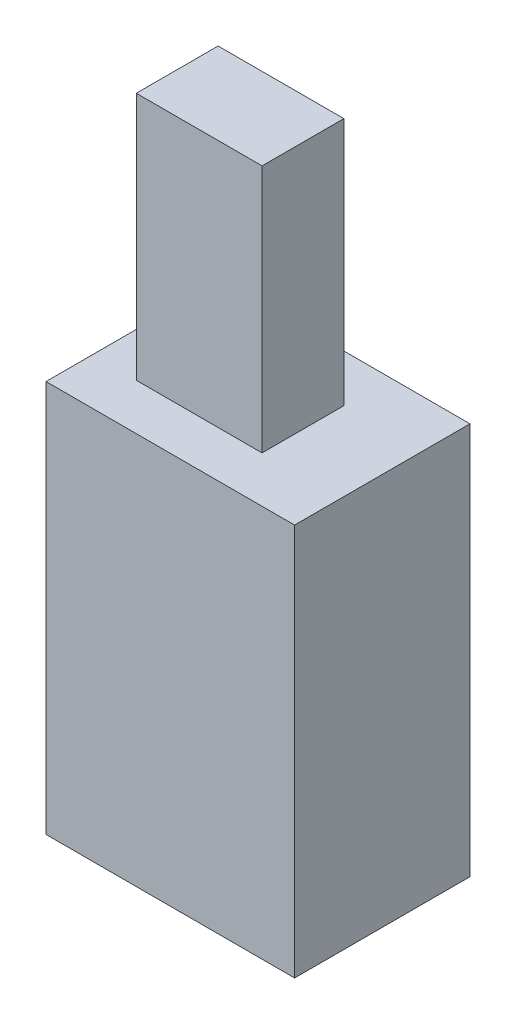
ISO-10303-21;
HEADER;
FILE_DESCRIPTION(('STEP AP214'),'2;1');
FILE_NAME('part.step','',(''),(''),'','','');
FILE_SCHEMA(('AUTOMOTIVE_DESIGN { 1 0 10303 214 1 1 1 1 }'));
ENDSEC;
DATA;
#1=APPLICATION_CONTEXT('core data for automotive mechanical design processes');
#2=APPLICATION_PROTOCOL_DEFINITION('international standard','automotive_design',2000,#1);
#3=PRODUCT_CONTEXT('',#1,'mechanical');
#4=PRODUCT('Part','Part','',(#3));
#5=PRODUCT_RELATED_PRODUCT_CATEGORY('part','',(#4));
#6=PRODUCT_DEFINITION_FORMATION('','',#4);
#7=PRODUCT_DEFINITION_CONTEXT('part definition',#1,'design');
#8=PRODUCT_DEFINITION('design','',#6,#7);
#9=PRODUCT_DEFINITION_SHAPE('','',#8);
#10=(LENGTH_UNIT() NAMED_UNIT(*) SI_UNIT(.MILLI.,.METRE.));
#11=(NAMED_UNIT(*) PLANE_ANGLE_UNIT() SI_UNIT($,.RADIAN.));
#12=(NAMED_UNIT(*) SI_UNIT($,.STERADIAN.) SOLID_ANGLE_UNIT());
#13=UNCERTAINTY_MEASURE_WITH_UNIT(LENGTH_MEASURE(1.E-05),#10,'distance_accuracy_value','');
#14=(GEOMETRIC_REPRESENTATION_CONTEXT(3) GLOBAL_UNCERTAINTY_ASSIGNED_CONTEXT((#13)) GLOBAL_UNIT_ASSIGNED_CONTEXT((#10,
#11,#12)) REPRESENTATION_CONTEXT('',''));
#15=CARTESIAN_POINT('',(0.,0.,0.));
#16=DIRECTION('',(0.,0.,1.));
#17=DIRECTION('',(1.,0.,0.));
#18=AXIS2_PLACEMENT_3D('',#15,#16,#17);
#19=CARTESIAN_POINT('',(40.,-49.1827456019109,23.0545343587494));
#20=DIRECTION('',(0.,1.,0.));
#21=DIRECTION('',(0.,0.,1.));
#22=AXIS2_PLACEMENT_3D('',#19,#20,#21);
#23=PLANE('',#22);
#24=DIRECTION('',(0.,0.,-1.));
#25=VECTOR('',#24,1.);
#26=CARTESIAN_POINT('',(0.,-49.1827456019109,23.0545343587494));
#27=LINE('',#26,#25);
#28=CARTESIAN_POINT('',(0.,-49.1827456019109,23.0545343587494));
#29=VERTEX_POINT('',#28);
#30=CARTESIAN_POINT('',(0.,-49.1827456019109,-5.1686601630081));
#31=VERTEX_POINT('',#30);
#32=EDGE_CURVE('E196',#29,#31,#27,.T.);
#33=ORIENTED_EDGE('',*,*,#32,.T.);
#34=DIRECTION('',(-1.,0.,0.));
#35=VECTOR('',#34,1.);
#36=CARTESIAN_POINT('',(40.,-49.1827456019109,-5.1686601630081));
#37=LINE('',#36,#35);
#38=CARTESIAN_POINT('',(40.,-49.1827456019109,-5.1686601630081));
#39=VERTEX_POINT('',#38);
#40=EDGE_CURVE('E42',#39,#31,#37,.T.);
#41=ORIENTED_EDGE('',*,*,#40,.F.);
#42=DIRECTION('',(0.,0.,-1.));
#43=VECTOR('',#42,1.);
#44=CARTESIAN_POINT('',(40.,-49.1827456019109,23.0545343587494));
#45=LINE('',#44,#43);
#46=CARTESIAN_POINT('',(40.,-49.1827456019109,23.0545343587494));
#47=VERTEX_POINT('',#46);
#48=EDGE_CURVE('E186',#47,#39,#45,.T.);
#49=ORIENTED_EDGE('',*,*,#48,.F.);
#50=DIRECTION('',(-1.,0.,0.));
#51=VECTOR('',#50,1.);
#52=CARTESIAN_POINT('',(40.,-49.1827456019109,23.0545343587494));
#53=LINE('',#52,#51);
#54=EDGE_CURVE('E11',#47,#29,#53,.T.);
#55=ORIENTED_EDGE('',*,*,#54,.T.);
#56=EDGE_LOOP('',(#33,#41,#49,#55));
#57=FACE_BOUND('',#56,.T.);
#58=DIRECTION('',(0.,0.,1.));
#59=VECTOR('',#58,1.);
#60=CARTESIAN_POINT('',(3.26512406669366,-49.1827456019109,13.9213634090538));
#61=LINE('',#60,#59);
#62=CARTESIAN_POINT('',(3.26512406669366,-49.1827456019109,-3.50766129720625));
#63=VERTEX_POINT('',#62);
#64=CARTESIAN_POINT('',(3.26512406669366,-49.1827456019109,13.9213634090538));
#65=VERTEX_POINT('',#64);
#66=EDGE_CURVE('E143',#63,#65,#61,.T.);
#67=ORIENTED_EDGE('',*,*,#66,.F.);
#68=DIRECTION('',(1.,0.,0.));
#69=VECTOR('',#68,1.);
#70=CARTESIAN_POINT('',(3.26512406669366,-49.1827456019109,-3.50766129720625));
#71=LINE('',#70,#69);
#72=CARTESIAN_POINT('',(1.49383084169585,-49.1827456019109,-3.50766129720625));
#73=VERTEX_POINT('',#72);
#74=EDGE_CURVE('E140',#73,#63,#71,.T.);
#75=ORIENTED_EDGE('',*,*,#74,.F.);
#76=DIRECTION('',(0.,0.,-1.));
#77=VECTOR('',#76,1.);
#78=CARTESIAN_POINT('',(1.49383084169585,-49.1827456019109,13.9213634090538));
#79=LINE('',#78,#77);
#80=CARTESIAN_POINT('',(1.49383084169585,-49.1827456019109,13.9213634090538));
#81=VERTEX_POINT('',#80);
#82=EDGE_CURVE('E54',#81,#73,#79,.T.);
#83=ORIENTED_EDGE('',*,*,#82,.F.);
#84=DIRECTION('',(-1.,0.,0.));
#85=VECTOR('',#84,1.);
#86=CARTESIAN_POINT('',(3.26512406669366,-49.1827456019109,13.9213634090538));
#87=LINE('',#86,#85);
#88=EDGE_CURVE('E49',#65,#81,#87,.T.);
#89=ORIENTED_EDGE('',*,*,#88,.F.);
#90=EDGE_LOOP('',(#67,#75,#83,#89));
#91=FACE_BOUND('',#90,.T.);
#92=ADVANCED_FACE('F34',(#57,#91),#23,.F.);
#93=CARTESIAN_POINT('',(40.,13.9355568443875,23.0545343587494));
#94=DIRECTION('',(0.,-1.,0.));
#95=DIRECTION('',(0.,0.,-1.));
#96=AXIS2_PLACEMENT_3D('',#93,#94,#95);
#97=PLANE('',#96);
#98=DIRECTION('',(0.,0.,1.));
#99=VECTOR('',#98,1.);
#100=CARTESIAN_POINT('',(0.,13.9355568443875,23.0545343587494));
#101=LINE('',#100,#99);
#102=CARTESIAN_POINT('',(0.,13.9355568443875,-5.1686601630081));
#103=VERTEX_POINT('',#102);
#104=CARTESIAN_POINT('',(0.,13.9355568443875,23.0545343587494));
#105=VERTEX_POINT('',#104);
#106=EDGE_CURVE('E187',#103,#105,#101,.T.);
#107=ORIENTED_EDGE('',*,*,#106,.T.);
#108=DIRECTION('',(-1.,0.,0.));
#109=VECTOR('',#108,1.);
#110=CARTESIAN_POINT('',(40.,13.9355568443875,23.0545343587494));
#111=LINE('',#110,#109);
#112=CARTESIAN_POINT('',(40.,13.9355568443875,23.0545343587494));
#113=VERTEX_POINT('',#112);
#114=EDGE_CURVE('E193',#113,#105,#111,.T.);
#115=ORIENTED_EDGE('',*,*,#114,.F.);
#116=DIRECTION('',(0.,0.,1.));
#117=VECTOR('',#116,1.);
#118=CARTESIAN_POINT('',(40.,13.9355568443875,23.0545343587494));
#119=LINE('',#118,#117);
#120=CARTESIAN_POINT('',(40.,13.9355568443875,-5.1686601630081));
#121=VERTEX_POINT('',#120);
#122=EDGE_CURVE('E191',#121,#113,#119,.T.);
#123=ORIENTED_EDGE('',*,*,#122,.F.);
#124=DIRECTION('',(-1.,0.,0.));
#125=VECTOR('',#124,1.);
#126=CARTESIAN_POINT('',(40.,13.9355568443875,-5.1686601630081));
#127=LINE('',#126,#125);
#128=EDGE_CURVE('E203',#121,#103,#127,.T.);
#129=ORIENTED_EDGE('',*,*,#128,.T.);
#130=EDGE_LOOP('',(#107,#115,#123,#129));
#131=FACE_BOUND('',#130,.T.);
#132=DIRECTION('',(0.,0.,1.));
#133=VECTOR('',#132,1.);
#134=CARTESIAN_POINT('',(7.08671618059498,13.9355568443875,2.45036978078872));
#135=LINE('',#134,#133);
#136=CARTESIAN_POINT('',(7.08671618059498,13.9355568443875,2.45036978078872));
#137=VERTEX_POINT('',#136);
#138=CARTESIAN_POINT('',(7.08671618059498,13.9355568443875,15.6158562248265));
#139=VERTEX_POINT('',#138);
#140=EDGE_CURVE('E144',#137,#139,#135,.T.);
#141=ORIENTED_EDGE('',*,*,#140,.F.);
#142=DIRECTION('',(-1.,0.,0.));
#143=VECTOR('',#142,1.);
#144=CARTESIAN_POINT('',(7.08671618059498,13.9355568443875,2.45036978078872));
#145=LINE('',#144,#143);
#146=CARTESIAN_POINT('',(27.3271157420822,13.9355568443875,2.45036978078872));
#147=VERTEX_POINT('',#146);
#148=EDGE_CURVE('E157',#147,#137,#145,.T.);
#149=ORIENTED_EDGE('',*,*,#148,.F.);
#150=DIRECTION('',(0.,0.,-1.));
#151=VECTOR('',#150,1.);
#152=CARTESIAN_POINT('',(27.3271157420822,13.9355568443875,2.45036978078872));
#153=LINE('',#152,#151);
#154=CARTESIAN_POINT('',(27.3271157420822,13.9355568443875,15.6158562248265));
#155=VERTEX_POINT('',#154);
#156=EDGE_CURVE('E166',#155,#147,#153,.T.);
#157=ORIENTED_EDGE('',*,*,#156,.F.);
#158=DIRECTION('',(1.,0.,0.));
#159=VECTOR('',#158,1.);
#160=CARTESIAN_POINT('',(7.08671618059498,13.9355568443875,15.6158562248265));
#161=LINE('',#160,#159);
#162=EDGE_CURVE('E147',#139,#155,#161,.T.);
#163=ORIENTED_EDGE('',*,*,#162,.F.);
#164=EDGE_LOOP('',(#141,#149,#157,#163));
#165=FACE_BOUND('',#164,.T.);
#166=ADVANCED_FACE('F219',(#131,#165),#97,.F.);
#167=CARTESIAN_POINT('',(40.,13.9355568443875,23.0545343587494));
#168=DIRECTION('',(0.,0.,-1.));
#169=DIRECTION('',(-1.,0.,0.));
#170=AXIS2_PLACEMENT_3D('',#167,#168,#169);
#171=PLANE('',#170);
#172=DIRECTION('',(0.,-1.,0.));
#173=VECTOR('',#172,1.);
#174=CARTESIAN_POINT('',(0.,13.9355568443875,23.0545343587494));
#175=LINE('',#174,#173);
#176=EDGE_CURVE('E182',#105,#29,#175,.T.);
#177=ORIENTED_EDGE('',*,*,#176,.T.);
#178=ORIENTED_EDGE('',*,*,#54,.F.);
#179=DIRECTION('',(0.,-1.,0.));
#180=VECTOR('',#179,1.);
#181=CARTESIAN_POINT('',(40.,13.9355568443875,23.0545343587494));
#182=LINE('',#181,#180);
#183=EDGE_CURVE('E183',#113,#47,#182,.T.);
#184=ORIENTED_EDGE('',*,*,#183,.F.);
#185=ORIENTED_EDGE('',*,*,#114,.T.);
#186=EDGE_LOOP('',(#177,#178,#184,#185));
#187=FACE_BOUND('',#186,.T.);
#188=ADVANCED_FACE('F36',(#187),#171,.F.);
#189=CARTESIAN_POINT('',(40.,13.9355568443875,-5.1686601630081));
#190=DIRECTION('',(0.,0.,1.));
#191=DIRECTION('',(1.,0.,0.));
#192=AXIS2_PLACEMENT_3D('',#189,#190,#191);
#193=PLANE('',#192);
#194=DIRECTION('',(0.,1.,0.));
#195=VECTOR('',#194,1.);
#196=CARTESIAN_POINT('',(0.,13.9355568443875,-5.1686601630081));
#197=LINE('',#196,#195);
#198=EDGE_CURVE('E198',#31,#103,#197,.T.);
#199=ORIENTED_EDGE('',*,*,#198,.T.);
#200=ORIENTED_EDGE('',*,*,#128,.F.);
#201=DIRECTION('',(0.,1.,0.));
#202=VECTOR('',#201,1.);
#203=CARTESIAN_POINT('',(40.,13.9355568443875,-5.1686601630081));
#204=LINE('',#203,#202);
#205=EDGE_CURVE('E189',#39,#121,#204,.T.);
#206=ORIENTED_EDGE('',*,*,#205,.F.);
#207=ORIENTED_EDGE('',*,*,#40,.T.);
#208=EDGE_LOOP('',(#199,#200,#206,#207));
#209=FACE_BOUND('',#208,.T.);
#210=ADVANCED_FACE('F210',(#209),#193,.F.);
#211=CARTESIAN_POINT('',(40.,0.,0.));
#212=DIRECTION('',(1.,0.,0.));
#213=DIRECTION('',(0.,0.,-1.));
#214=AXIS2_PLACEMENT_3D('',#211,#212,#213);
#215=PLANE('',#214);
#216=ORIENTED_EDGE('',*,*,#183,.T.);
#217=ORIENTED_EDGE('',*,*,#48,.T.);
#218=ORIENTED_EDGE('',*,*,#205,.T.);
#219=ORIENTED_EDGE('',*,*,#122,.T.);
#220=EDGE_LOOP('',(#216,#217,#218,#219));
#221=FACE_BOUND('',#220,.T.);
#222=ADVANCED_FACE('F226',(#221),#215,.T.);
#223=CARTESIAN_POINT('',(0.,0.,0.));
#224=DIRECTION('',(1.,0.,0.));
#225=DIRECTION('',(0.,0.,-1.));
#226=AXIS2_PLACEMENT_3D('',#223,#224,#225);
#227=PLANE('',#226);
#228=ORIENTED_EDGE('',*,*,#176,.F.);
#229=ORIENTED_EDGE('',*,*,#106,.F.);
#230=ORIENTED_EDGE('',*,*,#198,.F.);
#231=ORIENTED_EDGE('',*,*,#32,.F.);
#232=EDGE_LOOP('',(#228,#229,#230,#231));
#233=FACE_BOUND('',#232,.T.);
#234=ADVANCED_FACE('F216',(#233),#227,.F.);
#235=CARTESIAN_POINT('',(7.08671618059498,53.9355568443875,2.45036978078872));
#236=DIRECTION('',(1.,0.,0.));
#237=DIRECTION('',(0.,0.,-1.));
#238=AXIS2_PLACEMENT_3D('',#235,#236,#237);
#239=PLANE('',#238);
#240=ORIENTED_EDGE('',*,*,#140,.T.);
#241=DIRECTION('',(0.,-1.,0.));
#242=VECTOR('',#241,1.);
#243=CARTESIAN_POINT('',(7.08671618059498,53.9355568443875,15.6158562248265));
#244=LINE('',#243,#242);
#245=CARTESIAN_POINT('',(7.08671618059498,53.9355568443875,15.6158562248265));
#246=VERTEX_POINT('',#245);
#247=EDGE_CURVE('E179',#246,#139,#244,.T.);
#248=ORIENTED_EDGE('',*,*,#247,.F.);
#249=DIRECTION('',(0.,0.,1.));
#250=VECTOR('',#249,1.);
#251=CARTESIAN_POINT('',(7.08671618059498,53.9355568443875,2.45036978078872));
#252=LINE('',#251,#250);
#253=CARTESIAN_POINT('',(7.08671618059498,53.9355568443875,2.45036978078872));
#254=VERTEX_POINT('',#253);
#255=EDGE_CURVE('E153',#254,#246,#252,.T.);
#256=ORIENTED_EDGE('',*,*,#255,.F.);
#257=DIRECTION('',(0.,-1.,0.));
#258=VECTOR('',#257,1.);
#259=CARTESIAN_POINT('',(7.08671618059498,53.9355568443875,2.45036978078872));
#260=LINE('',#259,#258);
#261=EDGE_CURVE('E162',#254,#137,#260,.T.);
#262=ORIENTED_EDGE('',*,*,#261,.T.);
#263=EDGE_LOOP('',(#240,#248,#256,#262));
#264=FACE_BOUND('',#263,.T.);
#265=ADVANCED_FACE('F270',(#264),#239,.F.);
#266=CARTESIAN_POINT('',(7.08671618059498,53.9355568443875,15.6158562248265));
#267=DIRECTION('',(0.,0.,-1.));
#268=DIRECTION('',(-1.,0.,0.));
#269=AXIS2_PLACEMENT_3D('',#266,#267,#268);
#270=PLANE('',#269);
#271=ORIENTED_EDGE('',*,*,#162,.T.);
#272=DIRECTION('',(0.,-1.,0.));
#273=VECTOR('',#272,1.);
#274=CARTESIAN_POINT('',(27.3271157420822,53.9355568443875,15.6158562248265));
#275=LINE('',#274,#273);
#276=CARTESIAN_POINT('',(27.3271157420822,53.9355568443875,15.6158562248265));
#277=VERTEX_POINT('',#276);
#278=EDGE_CURVE('E176',#277,#155,#275,.T.);
#279=ORIENTED_EDGE('',*,*,#278,.F.);
#280=DIRECTION('',(1.,0.,0.));
#281=VECTOR('',#280,1.);
#282=CARTESIAN_POINT('',(7.08671618059498,53.9355568443875,15.6158562248265));
#283=LINE('',#282,#281);
#284=EDGE_CURVE('E156',#246,#277,#283,.T.);
#285=ORIENTED_EDGE('',*,*,#284,.F.);
#286=ORIENTED_EDGE('',*,*,#247,.T.);
#287=EDGE_LOOP('',(#271,#279,#285,#286));
#288=FACE_BOUND('',#287,.T.);
#289=ADVANCED_FACE('F266',(#288),#270,.F.);
#290=CARTESIAN_POINT('',(27.3271157420822,53.9355568443875,2.45036978078872));
#291=DIRECTION('',(-1.,0.,0.));
#292=DIRECTION('',(0.,0.,1.));
#293=AXIS2_PLACEMENT_3D('',#290,#291,#292);
#294=PLANE('',#293);
#295=ORIENTED_EDGE('',*,*,#156,.T.);
#296=DIRECTION('',(0.,-1.,0.));
#297=VECTOR('',#296,1.);
#298=CARTESIAN_POINT('',(27.3271157420822,53.9355568443875,2.45036978078872));
#299=LINE('',#298,#297);
#300=CARTESIAN_POINT('',(27.3271157420822,53.9355568443875,2.45036978078872));
#301=VERTEX_POINT('',#300);
#302=EDGE_CURVE('E173',#301,#147,#299,.T.);
#303=ORIENTED_EDGE('',*,*,#302,.F.);
#304=DIRECTION('',(0.,0.,-1.));
#305=VECTOR('',#304,1.);
#306=CARTESIAN_POINT('',(27.3271157420822,53.9355568443875,2.45036978078872));
#307=LINE('',#306,#305);
#308=EDGE_CURVE('E159',#277,#301,#307,.T.);
#309=ORIENTED_EDGE('',*,*,#308,.F.);
#310=ORIENTED_EDGE('',*,*,#278,.T.);
#311=EDGE_LOOP('',(#295,#303,#309,#310));
#312=FACE_BOUND('',#311,.T.);
#313=ADVANCED_FACE('F262',(#312),#294,.F.);
#314=CARTESIAN_POINT('',(7.08671618059498,53.9355568443875,2.45036978078872));
#315=DIRECTION('',(0.,0.,1.));
#316=DIRECTION('',(1.,0.,0.));
#317=AXIS2_PLACEMENT_3D('',#314,#315,#316);
#318=PLANE('',#317);
#319=ORIENTED_EDGE('',*,*,#148,.T.);
#320=ORIENTED_EDGE('',*,*,#261,.F.);
#321=DIRECTION('',(-1.,0.,0.));
#322=VECTOR('',#321,1.);
#323=CARTESIAN_POINT('',(7.08671618059498,53.9355568443875,2.45036978078872));
#324=LINE('',#323,#322);
#325=EDGE_CURVE('E161',#301,#254,#324,.T.);
#326=ORIENTED_EDGE('',*,*,#325,.F.);
#327=ORIENTED_EDGE('',*,*,#302,.T.);
#328=EDGE_LOOP('',(#319,#320,#326,#327));
#329=FACE_BOUND('',#328,.T.);
#330=ADVANCED_FACE('F258',(#329),#318,.F.);
#331=CARTESIAN_POINT('',(0.,53.9355568443875,0.));
#332=DIRECTION('',(0.,1.,0.));
#333=DIRECTION('',(0.,0.,1.));
#334=AXIS2_PLACEMENT_3D('',#331,#332,#333);
#335=PLANE('',#334);
#336=ORIENTED_EDGE('',*,*,#255,.T.);
#337=ORIENTED_EDGE('',*,*,#284,.T.);
#338=ORIENTED_EDGE('',*,*,#308,.T.);
#339=ORIENTED_EDGE('',*,*,#325,.T.);
#340=EDGE_LOOP('',(#336,#337,#338,#339));
#341=FACE_BOUND('',#340,.T.);
#342=ADVANCED_FACE('F255',(#341),#335,.T.);
#343=CARTESIAN_POINT('',(3.26512406669366,-54.1827456019109,13.9213634090538));
#344=DIRECTION('',(-1.,0.,0.));
#345=DIRECTION('',(0.,0.,1.));
#346=AXIS2_PLACEMENT_3D('',#343,#344,#345);
#347=PLANE('',#346);
#348=ORIENTED_EDGE('',*,*,#66,.T.);
#349=DIRECTION('',(0.,1.,0.));
#350=VECTOR('',#349,1.);
#351=CARTESIAN_POINT('',(3.26512406669366,-54.1827456019109,13.9213634090538));
#352=LINE('',#351,#350);
#353=CARTESIAN_POINT('',(3.26512406669366,-54.1827456019109,13.9213634090538));
#354=VERTEX_POINT('',#353);
#355=EDGE_CURVE('E124',#354,#65,#352,.T.);
#356=ORIENTED_EDGE('',*,*,#355,.F.);
#357=DIRECTION('',(0.,0.,1.));
#358=VECTOR('',#357,1.);
#359=CARTESIAN_POINT('',(3.26512406669366,-54.1827456019109,13.9213634090538));
#360=LINE('',#359,#358);
#361=CARTESIAN_POINT('',(3.26512406669366,-54.1827456019109,-3.50766129720625));
#362=VERTEX_POINT('',#361);
#363=EDGE_CURVE('E131',#362,#354,#360,.T.);
#364=ORIENTED_EDGE('',*,*,#363,.F.);
#365=DIRECTION('',(0.,1.,0.));
#366=VECTOR('',#365,1.);
#367=CARTESIAN_POINT('',(3.26512406669366,-54.1827456019109,-3.50766129720625));
#368=LINE('',#367,#366);
#369=EDGE_CURVE('E233',#362,#63,#368,.T.);
#370=ORIENTED_EDGE('',*,*,#369,.T.);
#371=EDGE_LOOP('',(#348,#356,#364,#370));
#372=FACE_BOUND('',#371,.T.);
#373=ADVANCED_FACE('F142',(#372),#347,.F.);
#374=CARTESIAN_POINT('',(3.26512406669366,-54.1827456019109,13.9213634090538));
#375=DIRECTION('',(0.,0.,-1.));
#376=DIRECTION('',(-1.,0.,0.));
#377=AXIS2_PLACEMENT_3D('',#374,#375,#376);
#378=PLANE('',#377);
#379=ORIENTED_EDGE('',*,*,#88,.T.);
#380=DIRECTION('',(0.,1.,0.));
#381=VECTOR('',#380,1.);
#382=CARTESIAN_POINT('',(1.49383084169585,-54.1827456019109,13.9213634090538));
#383=LINE('',#382,#381);
#384=CARTESIAN_POINT('',(1.49383084169585,-54.1827456019109,13.9213634090538));
#385=VERTEX_POINT('',#384);
#386=EDGE_CURVE('E127',#385,#81,#383,.T.);
#387=ORIENTED_EDGE('',*,*,#386,.F.);
#388=DIRECTION('',(-1.,0.,0.));
#389=VECTOR('',#388,1.);
#390=CARTESIAN_POINT('',(3.26512406669366,-54.1827456019109,13.9213634090538));
#391=LINE('',#390,#389);
#392=EDGE_CURVE('E120',#354,#385,#391,.T.);
#393=ORIENTED_EDGE('',*,*,#392,.F.);
#394=ORIENTED_EDGE('',*,*,#355,.T.);
#395=EDGE_LOOP('',(#379,#387,#393,#394));
#396=FACE_BOUND('',#395,.T.);
#397=ADVANCED_FACE('F122',(#396),#378,.F.);
#398=CARTESIAN_POINT('',(1.49383084169585,-54.1827456019109,13.9213634090538));
#399=DIRECTION('',(1.,0.,0.));
#400=DIRECTION('',(0.,0.,-1.));
#401=AXIS2_PLACEMENT_3D('',#398,#399,#400);
#402=PLANE('',#401);
#403=ORIENTED_EDGE('',*,*,#82,.T.);
#404=DIRECTION('',(0.,1.,0.));
#405=VECTOR('',#404,1.);
#406=CARTESIAN_POINT('',(1.49383084169585,-54.1827456019109,-3.50766129720625));
#407=LINE('',#406,#405);
#408=CARTESIAN_POINT('',(1.49383084169585,-54.1827456019109,-3.50766129720625));
#409=VERTEX_POINT('',#408);
#410=EDGE_CURVE('E149',#409,#73,#407,.T.);
#411=ORIENTED_EDGE('',*,*,#410,.F.);
#412=DIRECTION('',(0.,0.,-1.));
#413=VECTOR('',#412,1.);
#414=CARTESIAN_POINT('',(1.49383084169585,-54.1827456019109,13.9213634090538));
#415=LINE('',#414,#413);
#416=EDGE_CURVE('E130',#385,#409,#415,.T.);
#417=ORIENTED_EDGE('',*,*,#416,.F.);
#418=ORIENTED_EDGE('',*,*,#386,.T.);
#419=EDGE_LOOP('',(#403,#411,#417,#418));
#420=FACE_BOUND('',#419,.T.);
#421=ADVANCED_FACE('F242',(#420),#402,.F.);
#422=CARTESIAN_POINT('',(3.26512406669366,-54.1827456019109,-3.50766129720625));
#423=DIRECTION('',(0.,0.,1.));
#424=DIRECTION('',(1.,0.,0.));
#425=AXIS2_PLACEMENT_3D('',#422,#423,#424);
#426=PLANE('',#425);
#427=ORIENTED_EDGE('',*,*,#74,.T.);
#428=ORIENTED_EDGE('',*,*,#369,.F.);
#429=DIRECTION('',(1.,0.,0.));
#430=VECTOR('',#429,1.);
#431=CARTESIAN_POINT('',(3.26512406669366,-54.1827456019109,-3.50766129720625));
#432=LINE('',#431,#430);
#433=EDGE_CURVE('E136',#409,#362,#432,.T.);
#434=ORIENTED_EDGE('',*,*,#433,.F.);
#435=ORIENTED_EDGE('',*,*,#410,.T.);
#436=EDGE_LOOP('',(#427,#428,#434,#435));
#437=FACE_BOUND('',#436,.T.);
#438=ADVANCED_FACE('F232',(#437),#426,.F.);
#439=CARTESIAN_POINT('',(0.,-54.1827456019109,0.));
#440=DIRECTION('',(0.,1.,0.));
#441=DIRECTION('',(0.,0.,1.));
#442=AXIS2_PLACEMENT_3D('',#439,#440,#441);
#443=PLANE('',#442);
#444=ORIENTED_EDGE('',*,*,#363,.T.);
#445=ORIENTED_EDGE('',*,*,#392,.T.);
#446=ORIENTED_EDGE('',*,*,#416,.T.);
#447=ORIENTED_EDGE('',*,*,#433,.T.);
#448=EDGE_LOOP('',(#444,#445,#446,#447));
#449=FACE_BOUND('',#448,.T.);
#450=ADVANCED_FACE('F134',(#449),#443,.F.);
#451=CLOSED_SHELL('',(#92,#166,#188,#210,#222,#234,#265,#289,#313,#330,#342,#373,#397,#421,#438,#450));
#452=MANIFOLD_SOLID_BREP('B2',#451);
#453=ADVANCED_BREP_SHAPE_REPRESENTATION('',(#18,#452),#14);
#454=SHAPE_DEFINITION_REPRESENTATION(#9,#453);
ENDSEC;
END-ISO-10303-21;
